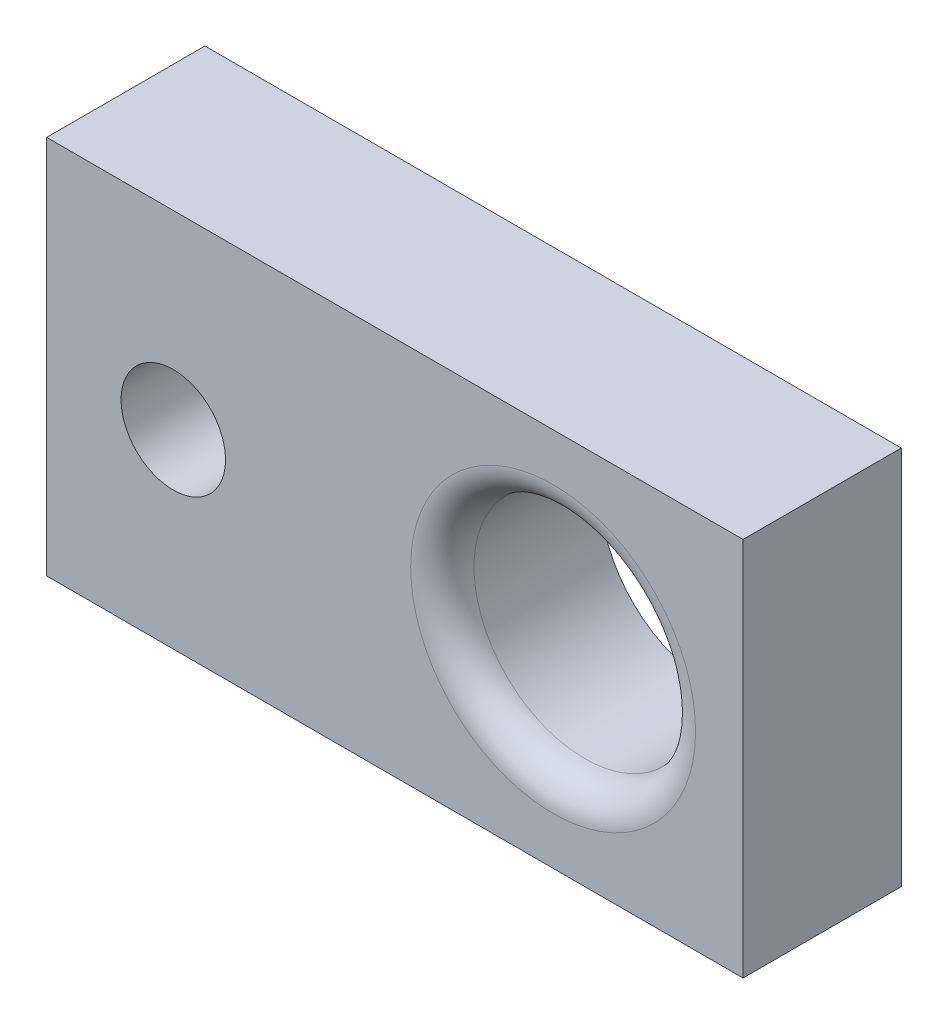
ISO-10303-21;
HEADER;
FILE_DESCRIPTION(('STEP AP214'),'2;1');
FILE_NAME('part.step','',(''),(''),'','','');
FILE_SCHEMA(('AUTOMOTIVE_DESIGN { 1 0 10303 214 1 1 1 1 }'));
ENDSEC;
DATA;
#1=APPLICATION_CONTEXT('core data for automotive mechanical design processes');
#2=APPLICATION_PROTOCOL_DEFINITION('international standard','automotive_design',2000,#1);
#3=PRODUCT_CONTEXT('',#1,'mechanical');
#4=PRODUCT('Part','Part','',(#3));
#5=PRODUCT_RELATED_PRODUCT_CATEGORY('part','',(#4));
#6=PRODUCT_DEFINITION_FORMATION('','',#4);
#7=PRODUCT_DEFINITION_CONTEXT('part definition',#1,'design');
#8=PRODUCT_DEFINITION('design','',#6,#7);
#9=PRODUCT_DEFINITION_SHAPE('','',#8);
#10=(LENGTH_UNIT() NAMED_UNIT(*) SI_UNIT(.MILLI.,.METRE.));
#11=(NAMED_UNIT(*) PLANE_ANGLE_UNIT() SI_UNIT($,.RADIAN.));
#12=(NAMED_UNIT(*) SI_UNIT($,.STERADIAN.) SOLID_ANGLE_UNIT());
#13=UNCERTAINTY_MEASURE_WITH_UNIT(LENGTH_MEASURE(1.E-05),#10,'distance_accuracy_value','');
#14=(GEOMETRIC_REPRESENTATION_CONTEXT(3) GLOBAL_UNCERTAINTY_ASSIGNED_CONTEXT((#13)) GLOBAL_UNIT_ASSIGNED_CONTEXT((#10,
#11,#12)) REPRESENTATION_CONTEXT('',''));
#15=CARTESIAN_POINT('',(0.,0.,0.));
#16=DIRECTION('',(0.,0.,1.));
#17=DIRECTION('',(1.,0.,0.));
#18=AXIS2_PLACEMENT_3D('',#15,#16,#17);
#19=CARTESIAN_POINT('',(-54.6494367800074,-3.55914158305464,5.));
#20=DIRECTION('',(1.,0.,0.));
#21=DIRECTION('',(0.,1.,0.));
#22=AXIS2_PLACEMENT_3D('',#19,#20,#21);
#23=PLANE('',#22);
#24=DIRECTION('',(0.,-1.,0.));
#25=VECTOR('',#24,1.);
#26=CARTESIAN_POINT('',(-54.6494367800074,-3.55914158305464,0.));
#27=LINE('',#26,#25);
#28=CARTESIAN_POINT('',(-54.6494367800074,-3.55914158305464,0.));
#29=VERTEX_POINT('',#28);
#30=CARTESIAN_POINT('',(-54.6494367800074,-15.5591415830546,0.));
#31=VERTEX_POINT('',#30);
#32=EDGE_CURVE('E98',#29,#31,#27,.T.);
#33=ORIENTED_EDGE('',*,*,#32,.T.);
#34=DIRECTION('',(0.,0.,-1.));
#35=VECTOR('',#34,1.);
#36=CARTESIAN_POINT('',(-54.6494367800074,-15.5591415830546,5.));
#37=LINE('',#36,#35);
#38=CARTESIAN_POINT('',(-54.6494367800074,-15.5591415830546,5.));
#39=VERTEX_POINT('',#38);
#40=EDGE_CURVE('E89',#39,#31,#37,.T.);
#41=ORIENTED_EDGE('',*,*,#40,.F.);
#42=DIRECTION('',(0.,-1.,0.));
#43=VECTOR('',#42,1.);
#44=CARTESIAN_POINT('',(-54.6494367800074,-3.55914158305464,5.));
#45=LINE('',#44,#43);
#46=CARTESIAN_POINT('',(-54.6494367800074,-3.55914158305464,5.));
#47=VERTEX_POINT('',#46);
#48=EDGE_CURVE('E83',#47,#39,#45,.T.);
#49=ORIENTED_EDGE('',*,*,#48,.F.);
#50=DIRECTION('',(0.,0.,-1.));
#51=VECTOR('',#50,1.);
#52=CARTESIAN_POINT('',(-54.6494367800074,-3.55914158305464,5.));
#53=LINE('',#52,#51);
#54=EDGE_CURVE('E94',#47,#29,#53,.T.);
#55=ORIENTED_EDGE('',*,*,#54,.T.);
#56=EDGE_LOOP('',(#33,#41,#49,#55));
#57=FACE_BOUND('',#56,.T.);
#58=ADVANCED_FACE('F30',(#57),#23,.F.);
#59=CARTESIAN_POINT('',(-54.6494367800074,-15.5591415830546,5.));
#60=DIRECTION('',(0.,1.,0.));
#61=DIRECTION('',(0.,0.,1.));
#62=AXIS2_PLACEMENT_3D('',#59,#60,#61);
#63=PLANE('',#62);
#64=DIRECTION('',(1.,0.,0.));
#65=VECTOR('',#64,1.);
#66=CARTESIAN_POINT('',(-54.6494367800074,-15.5591415830546,0.));
#67=LINE('',#66,#65);
#68=CARTESIAN_POINT('',(-32.6494367800074,-15.5591415830546,0.));
#69=VERTEX_POINT('',#68);
#70=EDGE_CURVE('E88',#31,#69,#67,.T.);
#71=ORIENTED_EDGE('',*,*,#70,.T.);
#72=DIRECTION('',(0.,0.,-1.));
#73=VECTOR('',#72,1.);
#74=CARTESIAN_POINT('',(-32.6494367800074,-15.5591415830546,5.));
#75=LINE('',#74,#73);
#76=CARTESIAN_POINT('',(-32.6494367800074,-15.5591415830546,5.));
#77=VERTEX_POINT('',#76);
#78=EDGE_CURVE('E86',#77,#69,#75,.T.);
#79=ORIENTED_EDGE('',*,*,#78,.F.);
#80=DIRECTION('',(1.,0.,0.));
#81=VECTOR('',#80,1.);
#82=CARTESIAN_POINT('',(-54.6494367800074,-15.5591415830546,5.));
#83=LINE('',#82,#81);
#84=EDGE_CURVE('E78',#39,#77,#83,.T.);
#85=ORIENTED_EDGE('',*,*,#84,.F.);
#86=ORIENTED_EDGE('',*,*,#40,.T.);
#87=EDGE_LOOP('',(#71,#79,#85,#86));
#88=FACE_BOUND('',#87,.T.);
#89=ADVANCED_FACE('F87',(#88),#63,.F.);
#90=CARTESIAN_POINT('',(-32.6494367800074,-3.55914158305464,5.));
#91=DIRECTION('',(-1.,0.,0.));
#92=DIRECTION('',(0.,0.,1.));
#93=AXIS2_PLACEMENT_3D('',#90,#91,#92);
#94=PLANE('',#93);
#95=DIRECTION('',(0.,1.,0.));
#96=VECTOR('',#95,1.);
#97=CARTESIAN_POINT('',(-32.6494367800074,-3.55914158305464,0.));
#98=LINE('',#97,#96);
#99=CARTESIAN_POINT('',(-32.6494367800074,-3.55914158305464,0.));
#100=VERTEX_POINT('',#99);
#101=EDGE_CURVE('E64',#69,#100,#98,.T.);
#102=ORIENTED_EDGE('',*,*,#101,.T.);
#103=DIRECTION('',(0.,0.,-1.));
#104=VECTOR('',#103,1.);
#105=CARTESIAN_POINT('',(-32.6494367800074,-3.55914158305464,5.));
#106=LINE('',#105,#104);
#107=CARTESIAN_POINT('',(-32.6494367800074,-3.55914158305464,5.));
#108=VERTEX_POINT('',#107);
#109=EDGE_CURVE('E90',#108,#100,#106,.T.);
#110=ORIENTED_EDGE('',*,*,#109,.F.);
#111=DIRECTION('',(0.,1.,0.));
#112=VECTOR('',#111,1.);
#113=CARTESIAN_POINT('',(-32.6494367800074,-3.55914158305464,5.));
#114=LINE('',#113,#112);
#115=EDGE_CURVE('E81',#77,#108,#114,.T.);
#116=ORIENTED_EDGE('',*,*,#115,.F.);
#117=ORIENTED_EDGE('',*,*,#78,.T.);
#118=EDGE_LOOP('',(#102,#110,#116,#117));
#119=FACE_BOUND('',#118,.T.);
#120=ADVANCED_FACE('F92',(#119),#94,.F.);
#121=CARTESIAN_POINT('',(-54.6494367800074,-3.55914158305464,5.));
#122=DIRECTION('',(0.,-1.,0.));
#123=DIRECTION('',(0.,0.,-1.));
#124=AXIS2_PLACEMENT_3D('',#121,#122,#123);
#125=PLANE('',#124);
#126=DIRECTION('',(-1.,0.,0.));
#127=VECTOR('',#126,1.);
#128=CARTESIAN_POINT('',(-54.6494367800074,-3.55914158305464,0.));
#129=LINE('',#128,#127);
#130=EDGE_CURVE('E70',#100,#29,#129,.T.);
#131=ORIENTED_EDGE('',*,*,#130,.T.);
#132=ORIENTED_EDGE('',*,*,#54,.F.);
#133=DIRECTION('',(-1.,0.,0.));
#134=VECTOR('',#133,1.);
#135=CARTESIAN_POINT('',(-54.6494367800074,-3.55914158305464,5.));
#136=LINE('',#135,#134);
#137=EDGE_CURVE('E47',#108,#47,#136,.T.);
#138=ORIENTED_EDGE('',*,*,#137,.F.);
#139=ORIENTED_EDGE('',*,*,#109,.T.);
#140=EDGE_LOOP('',(#131,#132,#138,#139));
#141=FACE_BOUND('',#140,.T.);
#142=ADVANCED_FACE('F131',(#141),#125,.F.);
#143=CARTESIAN_POINT('',(-54.6494367800074,-15.5591415830546,5.));
#144=DIRECTION('',(0.,0.,1.));
#145=DIRECTION('',(1.,0.,0.));
#146=AXIS2_PLACEMENT_3D('',#143,#144,#145);
#147=PLANE('',#146);
#148=CARTESIAN_POINT('',(-38.6494367800074,-9.55914158305464,5.));
#149=DIRECTION('',(0.,0.,1.));
#150=DIRECTION('',(1.,0.,0.));
#151=AXIS2_PLACEMENT_3D('',#148,#149,#150);
#152=CIRCLE('',#151,4.5);
#153=CARTESIAN_POINT('',(-34.1494367800074,-9.55914158305464,5.));
#154=VERTEX_POINT('',#153);
#155=EDGE_CURVE('E11',#154,#154,#152,.F.);
#156=ORIENTED_EDGE('',*,*,#155,.T.);
#157=EDGE_LOOP('',(#156));
#158=FACE_BOUND('',#157,.T.);
#159=CARTESIAN_POINT('',(-50.6494367800074,-9.55914158305464,5.));
#160=DIRECTION('',(0.,0.,1.));
#161=DIRECTION('',(1.,0.,0.));
#162=AXIS2_PLACEMENT_3D('',#159,#160,#161);
#163=CIRCLE('',#162,1.65);
#164=CARTESIAN_POINT('',(-48.9994367800074,-9.55914158305464,5.));
#165=VERTEX_POINT('',#164);
#166=EDGE_CURVE('E195',#165,#165,#163,.T.);
#167=ORIENTED_EDGE('',*,*,#166,.F.);
#168=EDGE_LOOP('',(#167));
#169=FACE_BOUND('',#168,.T.);
#170=ORIENTED_EDGE('',*,*,#48,.T.);
#171=ORIENTED_EDGE('',*,*,#84,.T.);
#172=ORIENTED_EDGE('',*,*,#115,.T.);
#173=ORIENTED_EDGE('',*,*,#137,.T.);
#174=EDGE_LOOP('',(#170,#171,#172,#173));
#175=FACE_BOUND('',#174,.T.);
#176=ADVANCED_FACE('F79',(#158,#169,#175),#147,.T.);
#177=CARTESIAN_POINT('',(-54.6494367800074,-15.5591415830546,0.));
#178=DIRECTION('',(0.,0.,1.));
#179=DIRECTION('',(1.,0.,0.));
#180=AXIS2_PLACEMENT_3D('',#177,#178,#179);
#181=PLANE('',#180);
#182=CARTESIAN_POINT('',(-50.6494367800074,-9.55914158305464,0.));
#183=DIRECTION('',(0.,0.,1.));
#184=DIRECTION('',(1.,0.,0.));
#185=AXIS2_PLACEMENT_3D('',#182,#183,#184);
#186=CIRCLE('',#185,1.65);
#187=CARTESIAN_POINT('',(-48.9994367800074,-9.55914158305464,0.));
#188=VERTEX_POINT('',#187);
#189=EDGE_CURVE('E197',#188,#188,#186,.T.);
#190=ORIENTED_EDGE('',*,*,#189,.T.);
#191=EDGE_LOOP('',(#190));
#192=FACE_BOUND('',#191,.T.);
#193=CARTESIAN_POINT('',(-38.6494367800074,-9.55914158305464,0.));
#194=DIRECTION('',(0.,0.,1.));
#195=DIRECTION('',(1.,0.,0.));
#196=AXIS2_PLACEMENT_3D('',#193,#194,#195);
#197=CIRCLE('',#196,3.5);
#198=CARTESIAN_POINT('',(-35.1494367800074,-9.55914158305464,0.));
#199=VERTEX_POINT('',#198);
#200=EDGE_CURVE('E101',#199,#199,#197,.T.);
#201=ORIENTED_EDGE('',*,*,#200,.T.);
#202=EDGE_LOOP('',(#201));
#203=FACE_BOUND('',#202,.T.);
#204=ORIENTED_EDGE('',*,*,#32,.F.);
#205=ORIENTED_EDGE('',*,*,#130,.F.);
#206=ORIENTED_EDGE('',*,*,#101,.F.);
#207=ORIENTED_EDGE('',*,*,#70,.F.);
#208=EDGE_LOOP('',(#204,#205,#206,#207));
#209=FACE_BOUND('',#208,.T.);
#210=ADVANCED_FACE('F134',(#192,#203,#209),#181,.F.);
#211=CARTESIAN_POINT('',(-38.6494367800074,-9.55914158305464,5.));
#212=DIRECTION('',(0.,0.,1.));
#213=DIRECTION('',(1.,0.,0.));
#214=AXIS2_PLACEMENT_3D('',#211,#212,#213);
#215=CYLINDRICAL_SURFACE('',#214,3.5);
#216=CARTESIAN_POINT('',(-38.6494367800074,-9.55914158305464,4.));
#217=DIRECTION('',(0.,0.,1.));
#218=DIRECTION('',(1.,0.,0.));
#219=AXIS2_PLACEMENT_3D('',#216,#217,#218);
#220=CIRCLE('',#219,3.5);
#221=CARTESIAN_POINT('',(-35.1494367800074,-9.55914158305464,4.));
#222=VERTEX_POINT('',#221);
#223=EDGE_CURVE('E39',#222,#222,#220,.T.);
#224=ORIENTED_EDGE('',*,*,#223,.T.);
#225=EDGE_LOOP('',(#224));
#226=FACE_BOUND('',#225,.T.);
#227=ORIENTED_EDGE('',*,*,#200,.F.);
#228=EDGE_LOOP('',(#227));
#229=FACE_BOUND('',#228,.T.);
#230=ADVANCED_FACE('F110',(#226,#229),#215,.F.);
#231=CARTESIAN_POINT('',(-50.6494367800074,-9.55914158305464,5.));
#232=DIRECTION('',(0.,0.,1.));
#233=DIRECTION('',(1.,0.,0.));
#234=AXIS2_PLACEMENT_3D('',#231,#232,#233);
#235=CYLINDRICAL_SURFACE('',#234,1.65);
#236=ORIENTED_EDGE('',*,*,#189,.F.);
#237=EDGE_LOOP('',(#236));
#238=FACE_BOUND('',#237,.T.);
#239=ORIENTED_EDGE('',*,*,#166,.T.);
#240=EDGE_LOOP('',(#239));
#241=FACE_BOUND('',#240,.T.);
#242=ADVANCED_FACE('F114',(#238,#241),#235,.F.);
#243=CARTESIAN_POINT('',(-38.6494367800074,-9.55914158305464,4.));
#244=DIRECTION('',(0.,0.,1.));
#245=DIRECTION('',(1.,0.,0.));
#246=AXIS2_PLACEMENT_3D('',#243,#244,#245);
#247=TOROIDAL_SURFACE('',#246,4.5,1.);
#248=ORIENTED_EDGE('',*,*,#155,.F.);
#249=EDGE_LOOP('',(#248));
#250=FACE_BOUND('',#249,.T.);
#251=ORIENTED_EDGE('',*,*,#223,.F.);
#252=EDGE_LOOP('',(#251));
#253=FACE_BOUND('',#252,.T.);
#254=ADVANCED_FACE('F32',(#250,#253),#247,.T.);
#255=CLOSED_SHELL('',(#58,#89,#120,#142,#176,#210,#230,#242,#254));
#256=MANIFOLD_SOLID_BREP('B2',#255);
#257=ADVANCED_BREP_SHAPE_REPRESENTATION('',(#18,#256),#14);
#258=SHAPE_DEFINITION_REPRESENTATION(#9,#257);
ENDSEC;
END-ISO-10303-21;
